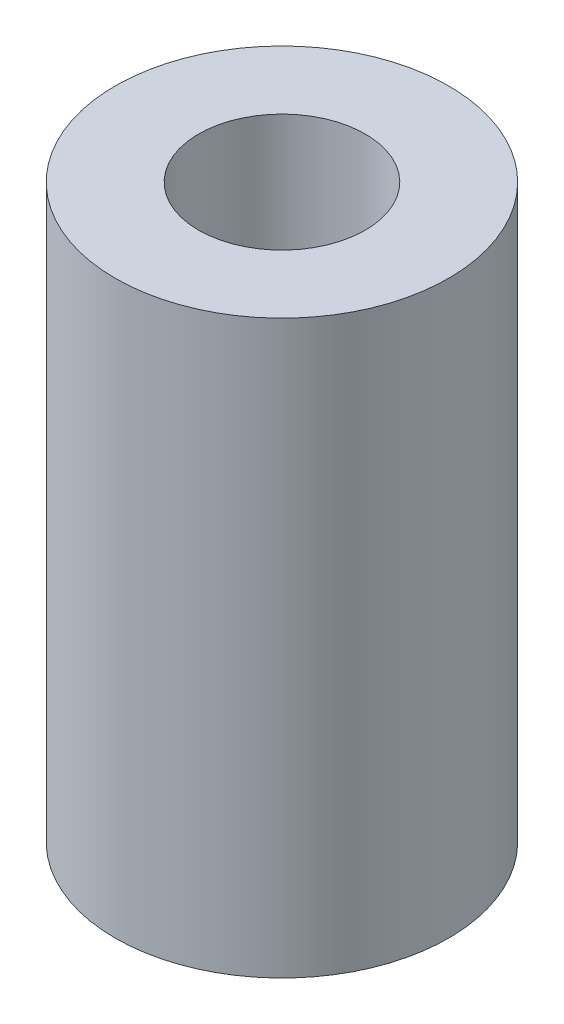
ISO-10303-21;
HEADER;
FILE_DESCRIPTION(('STEP AP214'),'2;1');
FILE_NAME('part.step','',(''),(''),'','','');
FILE_SCHEMA(('AUTOMOTIVE_DESIGN { 1 0 10303 214 1 1 1 1 }'));
ENDSEC;
DATA;
#1=APPLICATION_CONTEXT('core data for automotive mechanical design processes');
#2=APPLICATION_PROTOCOL_DEFINITION('international standard','automotive_design',2000,#1);
#3=PRODUCT_CONTEXT('',#1,'mechanical');
#4=PRODUCT('Part','Part','',(#3));
#5=PRODUCT_RELATED_PRODUCT_CATEGORY('part','',(#4));
#6=PRODUCT_DEFINITION_FORMATION('','',#4);
#7=PRODUCT_DEFINITION_CONTEXT('part definition',#1,'design');
#8=PRODUCT_DEFINITION('design','',#6,#7);
#9=PRODUCT_DEFINITION_SHAPE('','',#8);
#10=(LENGTH_UNIT() NAMED_UNIT(*) SI_UNIT(.MILLI.,.METRE.));
#11=(NAMED_UNIT(*) PLANE_ANGLE_UNIT() SI_UNIT($,.RADIAN.));
#12=(NAMED_UNIT(*) SI_UNIT($,.STERADIAN.) SOLID_ANGLE_UNIT());
#13=UNCERTAINTY_MEASURE_WITH_UNIT(LENGTH_MEASURE(1.E-05),#10,'distance_accuracy_value','');
#14=(GEOMETRIC_REPRESENTATION_CONTEXT(3) GLOBAL_UNCERTAINTY_ASSIGNED_CONTEXT((#13)) GLOBAL_UNIT_ASSIGNED_CONTEXT((#10,
#11,#12)) REPRESENTATION_CONTEXT('',''));
#15=CARTESIAN_POINT('',(0.,0.,0.));
#16=DIRECTION('',(0.,0.,1.));
#17=DIRECTION('',(1.,0.,0.));
#18=AXIS2_PLACEMENT_3D('',#15,#16,#17);
#19=CARTESIAN_POINT('',(0.,12.,0.));
#20=DIRECTION('',(0.,1.,0.));
#21=DIRECTION('',(0.,0.,1.));
#22=AXIS2_PLACEMENT_3D('',#19,#20,#21);
#23=PLANE('',#22);
#24=CARTESIAN_POINT('',(0.,12.,0.));
#25=DIRECTION('',(0.,1.,0.));
#26=DIRECTION('',(0.,0.,1.));
#27=AXIS2_PLACEMENT_3D('',#24,#25,#26);
#28=CIRCLE('',#27,3.5);
#29=CARTESIAN_POINT('',(0.,12.,3.5));
#30=VERTEX_POINT('',#29);
#31=EDGE_CURVE('E10',#30,#30,#28,.T.);
#32=ORIENTED_EDGE('',*,*,#31,.T.);
#33=EDGE_LOOP('',(#32));
#34=FACE_BOUND('',#33,.T.);
#35=CARTESIAN_POINT('',(0.,12.,0.));
#36=DIRECTION('',(0.,1.,0.));
#37=DIRECTION('',(0.,0.,1.));
#38=AXIS2_PLACEMENT_3D('',#35,#36,#37);
#39=CIRCLE('',#38,1.75);
#40=CARTESIAN_POINT('',(0.,12.,1.75));
#41=VERTEX_POINT('',#40);
#42=EDGE_CURVE('E43',#41,#41,#39,.T.);
#43=ORIENTED_EDGE('',*,*,#42,.F.);
#44=EDGE_LOOP('',(#43));
#45=FACE_BOUND('',#44,.T.);
#46=ADVANCED_FACE('F32',(#34,#45),#23,.T.);
#47=CARTESIAN_POINT('',(0.,0.,0.));
#48=DIRECTION('',(0.,1.,0.));
#49=DIRECTION('',(0.,0.,1.));
#50=AXIS2_PLACEMENT_3D('',#47,#48,#49);
#51=PLANE('',#50);
#52=CARTESIAN_POINT('',(0.,0.,0.));
#53=DIRECTION('',(0.,1.,0.));
#54=DIRECTION('',(0.,0.,1.));
#55=AXIS2_PLACEMENT_3D('',#52,#53,#54);
#56=CIRCLE('',#55,3.5);
#57=CARTESIAN_POINT('',(0.,0.,3.5));
#58=VERTEX_POINT('',#57);
#59=EDGE_CURVE('E36',#58,#58,#56,.T.);
#60=ORIENTED_EDGE('',*,*,#59,.F.);
#61=EDGE_LOOP('',(#60));
#62=FACE_BOUND('',#61,.T.);
#63=CARTESIAN_POINT('',(0.,0.,0.));
#64=DIRECTION('',(0.,1.,0.));
#65=DIRECTION('',(0.,0.,1.));
#66=AXIS2_PLACEMENT_3D('',#63,#64,#65);
#67=CIRCLE('',#66,1.75);
#68=CARTESIAN_POINT('',(0.,0.,1.75));
#69=VERTEX_POINT('',#68);
#70=EDGE_CURVE('E45',#69,#69,#67,.T.);
#71=ORIENTED_EDGE('',*,*,#70,.T.);
#72=EDGE_LOOP('',(#71));
#73=FACE_BOUND('',#72,.T.);
#74=ADVANCED_FACE('F55',(#62,#73),#51,.F.);
#75=CARTESIAN_POINT('',(0.,12.,0.));
#76=DIRECTION('',(0.,-1.,0.));
#77=DIRECTION('',(0.,0.,-1.));
#78=AXIS2_PLACEMENT_3D('',#75,#76,#77);
#79=CYLINDRICAL_SURFACE('',#78,3.5);
#80=ORIENTED_EDGE('',*,*,#31,.F.);
#81=EDGE_LOOP('',(#80));
#82=FACE_BOUND('',#81,.T.);
#83=ORIENTED_EDGE('',*,*,#59,.T.);
#84=EDGE_LOOP('',(#83));
#85=FACE_BOUND('',#84,.T.);
#86=ADVANCED_FACE('F34',(#82,#85),#79,.T.);
#87=CARTESIAN_POINT('',(0.,12.,0.));
#88=DIRECTION('',(0.,-1.,0.));
#89=DIRECTION('',(0.,0.,-1.));
#90=AXIS2_PLACEMENT_3D('',#87,#88,#89);
#91=CYLINDRICAL_SURFACE('',#90,1.75);
#92=ORIENTED_EDGE('',*,*,#42,.T.);
#93=EDGE_LOOP('',(#92));
#94=FACE_BOUND('',#93,.T.);
#95=ORIENTED_EDGE('',*,*,#70,.F.);
#96=EDGE_LOOP('',(#95));
#97=FACE_BOUND('',#96,.T.);
#98=ADVANCED_FACE('F51',(#94,#97),#91,.F.);
#99=CLOSED_SHELL('',(#46,#74,#86,#98));
#100=MANIFOLD_SOLID_BREP('B2',#99);
#101=ADVANCED_BREP_SHAPE_REPRESENTATION('',(#18,#100),#14);
#102=SHAPE_DEFINITION_REPRESENTATION(#9,#101);
ENDSEC;
END-ISO-10303-21;
